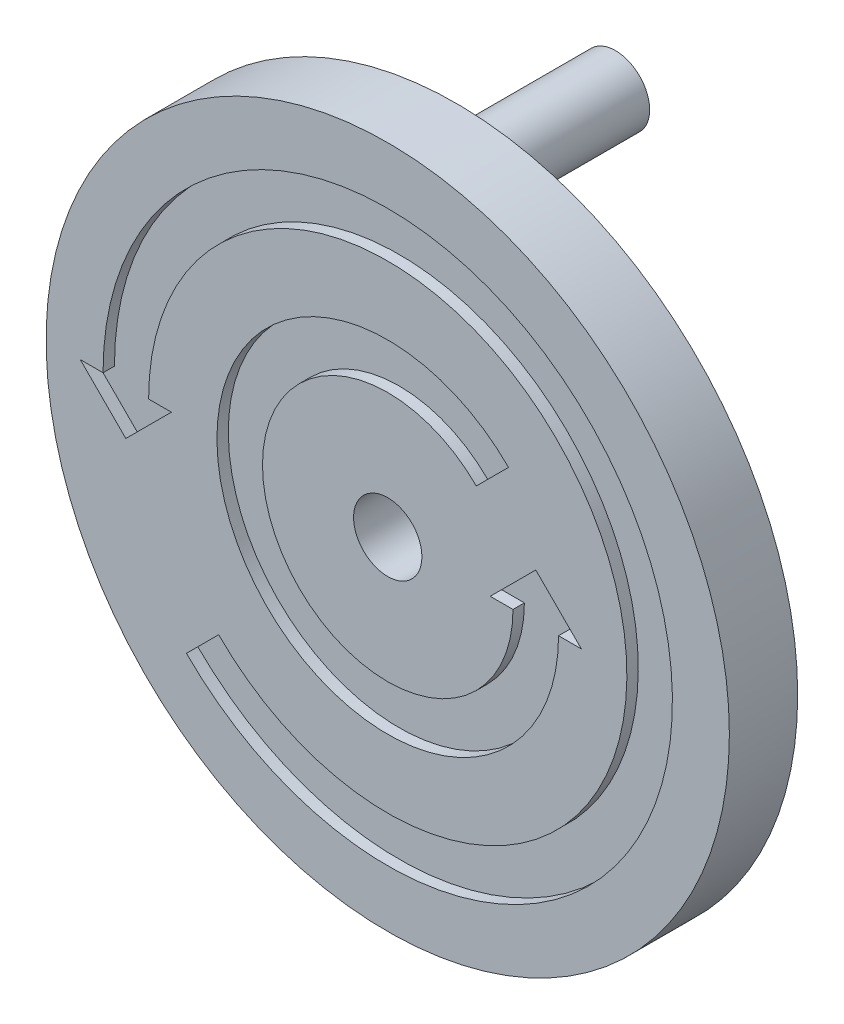
ISO-10303-21;
HEADER;
FILE_DESCRIPTION(('STEP AP214'),'2;1');
FILE_NAME('part.step','',(''),(''),'','','');
FILE_SCHEMA(('AUTOMOTIVE_DESIGN { 1 0 10303 214 1 1 1 1 }'));
ENDSEC;
DATA;
#1=APPLICATION_CONTEXT('core data for automotive mechanical design processes');
#2=APPLICATION_PROTOCOL_DEFINITION('international standard','automotive_design',2000,#1);
#3=PRODUCT_CONTEXT('',#1,'mechanical');
#4=PRODUCT('Part','Part','',(#3));
#5=PRODUCT_RELATED_PRODUCT_CATEGORY('part','',(#4));
#6=PRODUCT_DEFINITION_FORMATION('','',#4);
#7=PRODUCT_DEFINITION_CONTEXT('part definition',#1,'design');
#8=PRODUCT_DEFINITION('design','',#6,#7);
#9=PRODUCT_DEFINITION_SHAPE('','',#8);
#10=(LENGTH_UNIT() NAMED_UNIT(*) SI_UNIT(.MILLI.,.METRE.));
#11=(NAMED_UNIT(*) PLANE_ANGLE_UNIT() SI_UNIT($,.RADIAN.));
#12=(NAMED_UNIT(*) SI_UNIT($,.STERADIAN.) SOLID_ANGLE_UNIT());
#13=UNCERTAINTY_MEASURE_WITH_UNIT(LENGTH_MEASURE(1.E-05),#10,'distance_accuracy_value','');
#14=(GEOMETRIC_REPRESENTATION_CONTEXT(3) GLOBAL_UNCERTAINTY_ASSIGNED_CONTEXT((#13)) GLOBAL_UNIT_ASSIGNED_CONTEXT((#10,
#11,#12)) REPRESENTATION_CONTEXT('',''));
#15=CARTESIAN_POINT('',(0.,0.,0.));
#16=DIRECTION('',(0.,0.,1.));
#17=DIRECTION('',(1.,0.,0.));
#18=AXIS2_PLACEMENT_3D('',#15,#16,#17);
#19=CARTESIAN_POINT('',(0.,0.,3.));
#20=DIRECTION('',(0.,0.,1.));
#21=DIRECTION('',(1.,0.,0.));
#22=AXIS2_PLACEMENT_3D('',#19,#20,#21);
#23=PLANE('',#22);
#24=CARTESIAN_POINT('',(0.,0.,3.));
#25=DIRECTION('',(0.,0.,1.));
#26=DIRECTION('',(1.,0.,0.));
#27=AXIS2_PLACEMENT_3D('',#24,#25,#26);
#28=CIRCLE('',#27,12.5);
#29=CARTESIAN_POINT('',(-8.83883476483183,-8.83883476483186,3.));
#30=VERTEX_POINT('',#29);
#31=CARTESIAN_POINT('',(-12.5,0.,3.));
#32=VERTEX_POINT('',#31);
#33=EDGE_CURVE('E58',#30,#32,#28,.T.);
#34=ORIENTED_EDGE('',*,*,#33,.F.);
#35=DIRECTION('',(-0.707106781186546,-0.707106781186549,0.));
#36=VECTOR('',#35,1.);
#37=CARTESIAN_POINT('',(-7.42462120245874,-7.42462120245877,3.));
#38=LINE('',#37,#36);
#39=CARTESIAN_POINT('',(-7.42462120245874,-7.42462120245877,3.));
#40=VERTEX_POINT('',#39);
#41=EDGE_CURVE('E153',#40,#30,#38,.T.);
#42=ORIENTED_EDGE('',*,*,#41,.F.);
#43=CARTESIAN_POINT('',(0.,0.,3.));
#44=DIRECTION('',(0.,0.,-1.));
#45=DIRECTION('',(1.,0.,0.));
#46=AXIS2_PLACEMENT_3D('',#43,#44,#45);
#47=CIRCLE('',#46,10.5);
#48=CARTESIAN_POINT('',(-10.5,0.,3.));
#49=VERTEX_POINT('',#48);
#50=EDGE_CURVE('E158',#49,#40,#47,.T.);
#51=ORIENTED_EDGE('',*,*,#50,.F.);
#52=DIRECTION('',(-1.,0.,0.));
#53=VECTOR('',#52,1.);
#54=CARTESIAN_POINT('',(-9.5,0.,3.));
#55=LINE('',#54,#53);
#56=CARTESIAN_POINT('',(-9.5,0.,3.));
#57=VERTEX_POINT('',#56);
#58=EDGE_CURVE('E514',#57,#49,#55,.T.);
#59=ORIENTED_EDGE('',*,*,#58,.F.);
#60=DIRECTION('',(0.707106781186547,0.707106781186548,0.));
#61=VECTOR('',#60,1.);
#62=CARTESIAN_POINT('',(-11.5,-2.,3.));
#63=LINE('',#62,#61);
#64=CARTESIAN_POINT('',(-11.5,-2.,3.));
#65=VERTEX_POINT('',#64);
#66=EDGE_CURVE('E513',#65,#57,#63,.T.);
#67=ORIENTED_EDGE('',*,*,#66,.F.);
#68=DIRECTION('',(0.707106781186547,-0.707106781186548,0.));
#69=VECTOR('',#68,1.);
#70=CARTESIAN_POINT('',(-13.5,0.,3.));
#71=LINE('',#70,#69);
#72=CARTESIAN_POINT('',(-13.5,0.,3.));
#73=VERTEX_POINT('',#72);
#74=EDGE_CURVE('E168',#73,#65,#71,.T.);
#75=ORIENTED_EDGE('',*,*,#74,.F.);
#76=DIRECTION('',(-1.,0.,0.));
#77=VECTOR('',#76,1.);
#78=CARTESIAN_POINT('',(-12.5,0.,3.));
#79=LINE('',#78,#77);
#80=EDGE_CURVE('E164',#32,#73,#79,.T.);
#81=ORIENTED_EDGE('',*,*,#80,.F.);
#82=EDGE_LOOP('',(#34,#42,#51,#59,#67,#75,#81));
#83=FACE_BOUND('',#82,.T.);
#84=CARTESIAN_POINT('',(0.,0.,3.));
#85=DIRECTION('',(0.,0.,-1.));
#86=DIRECTION('',(1.,0.,0.));
#87=AXIS2_PLACEMENT_3D('',#84,#85,#86);
#88=CIRCLE('',#87,5.5);
#89=CARTESIAN_POINT('',(5.5,0.,3.));
#90=VERTEX_POINT('',#89);
#91=CARTESIAN_POINT('',(3.889087296526,3.88908729652602,3.));
#92=VERTEX_POINT('',#91);
#93=EDGE_CURVE('E66',#90,#92,#88,.T.);
#94=ORIENTED_EDGE('',*,*,#93,.F.);
#95=DIRECTION('',(1.,0.,0.));
#96=VECTOR('',#95,1.);
#97=CARTESIAN_POINT('',(5.5,0.,3.));
#98=LINE('',#97,#96);
#99=CARTESIAN_POINT('',(4.5,0.,3.));
#100=VERTEX_POINT('',#99);
#101=EDGE_CURVE('E195',#100,#90,#98,.T.);
#102=ORIENTED_EDGE('',*,*,#101,.F.);
#103=DIRECTION('',(-0.707106781186547,-0.707106781186548,0.));
#104=VECTOR('',#103,1.);
#105=CARTESIAN_POINT('',(4.5,0.,3.));
#106=LINE('',#105,#104);
#107=CARTESIAN_POINT('',(6.5,2.,3.));
#108=VERTEX_POINT('',#107);
#109=EDGE_CURVE('E225',#108,#100,#106,.T.);
#110=ORIENTED_EDGE('',*,*,#109,.F.);
#111=DIRECTION('',(-0.707106781186548,0.707106781186547,0.));
#112=VECTOR('',#111,1.);
#113=CARTESIAN_POINT('',(6.5,2.,3.));
#114=LINE('',#113,#112);
#115=CARTESIAN_POINT('',(8.5,0.,3.));
#116=VERTEX_POINT('',#115);
#117=EDGE_CURVE('E222',#116,#108,#114,.T.);
#118=ORIENTED_EDGE('',*,*,#117,.F.);
#119=DIRECTION('',(1.,0.,0.));
#120=VECTOR('',#119,1.);
#121=CARTESIAN_POINT('',(8.5,0.,3.));
#122=LINE('',#121,#120);
#123=CARTESIAN_POINT('',(7.5,0.,3.));
#124=VERTEX_POINT('',#123);
#125=EDGE_CURVE('E219',#124,#116,#122,.T.);
#126=ORIENTED_EDGE('',*,*,#125,.F.);
#127=CARTESIAN_POINT('',(0.,0.,3.));
#128=DIRECTION('',(0.,0.,1.));
#129=DIRECTION('',(1.,0.,0.));
#130=AXIS2_PLACEMENT_3D('',#127,#128,#129);
#131=CIRCLE('',#130,7.5);
#132=CARTESIAN_POINT('',(5.3033008588991,5.30330085889912,3.));
#133=VERTEX_POINT('',#132);
#134=EDGE_CURVE('E216',#133,#124,#131,.T.);
#135=ORIENTED_EDGE('',*,*,#134,.F.);
#136=DIRECTION('',(0.707106781186546,0.707106781186549,0.));
#137=VECTOR('',#136,1.);
#138=CARTESIAN_POINT('',(3.889087296526,3.88908729652602,3.));
#139=LINE('',#138,#137);
#140=EDGE_CURVE('E166',#92,#133,#139,.T.);
#141=ORIENTED_EDGE('',*,*,#140,.F.);
#142=EDGE_LOOP('',(#94,#102,#110,#118,#126,#135,#141));
#143=FACE_BOUND('',#142,.T.);
#144=CARTESIAN_POINT('',(0.,0.,3.));
#145=DIRECTION('',(0.,0.,1.));
#146=DIRECTION('',(1.,0.,0.));
#147=AXIS2_PLACEMENT_3D('',#144,#145,#146);
#148=CIRCLE('',#147,15.);
#149=CARTESIAN_POINT('',(15.,0.,3.));
#150=VERTEX_POINT('',#149);
#151=EDGE_CURVE('E11',#150,#150,#148,.T.);
#152=ORIENTED_EDGE('',*,*,#151,.T.);
#153=EDGE_LOOP('',(#152));
#154=FACE_BOUND('',#153,.T.);
#155=CARTESIAN_POINT('',(0.,0.,3.));
#156=DIRECTION('',(0.,0.,1.));
#157=DIRECTION('',(1.,0.,0.));
#158=AXIS2_PLACEMENT_3D('',#155,#156,#157);
#159=CIRCLE('',#158,1.5);
#160=CARTESIAN_POINT('',(1.5,0.,3.));
#161=VERTEX_POINT('',#160);
#162=EDGE_CURVE('E256',#161,#161,#159,.T.);
#163=ORIENTED_EDGE('',*,*,#162,.F.);
#164=EDGE_LOOP('',(#163));
#165=FACE_BOUND('',#164,.T.);
#166=ADVANCED_FACE('F43',(#83,#143,#154,#165),#23,.T.);
#167=CARTESIAN_POINT('',(0.,0.,0.));
#168=DIRECTION('',(0.,0.,1.));
#169=DIRECTION('',(1.,0.,0.));
#170=AXIS2_PLACEMENT_3D('',#167,#168,#169);
#171=PLANE('',#170);
#172=CARTESIAN_POINT('',(0.,0.,0.));
#173=DIRECTION('',(0.,0.,1.));
#174=DIRECTION('',(1.,0.,0.));
#175=AXIS2_PLACEMENT_3D('',#172,#173,#174);
#176=CIRCLE('',#175,15.);
#177=CARTESIAN_POINT('',(15.,0.,0.));
#178=VERTEX_POINT('',#177);
#179=EDGE_CURVE('E47',#178,#178,#176,.T.);
#180=ORIENTED_EDGE('',*,*,#179,.F.);
#181=EDGE_LOOP('',(#180));
#182=FACE_BOUND('',#181,.T.);
#183=CARTESIAN_POINT('',(0.,12.,0.));
#184=DIRECTION('',(0.,0.,1.));
#185=DIRECTION('',(1.,0.,0.));
#186=AXIS2_PLACEMENT_3D('',#183,#184,#185);
#187=CIRCLE('',#186,1.5);
#188=CARTESIAN_POINT('',(1.5,12.,0.));
#189=VERTEX_POINT('',#188);
#190=EDGE_CURVE('E247',#189,#189,#187,.T.);
#191=ORIENTED_EDGE('',*,*,#190,.T.);
#192=EDGE_LOOP('',(#191));
#193=FACE_BOUND('',#192,.T.);
#194=CARTESIAN_POINT('',(0.,-12.,0.));
#195=DIRECTION('',(0.,0.,1.));
#196=DIRECTION('',(1.,0.,0.));
#197=AXIS2_PLACEMENT_3D('',#194,#195,#196);
#198=CIRCLE('',#197,1.5);
#199=CARTESIAN_POINT('',(1.5,-12.,0.));
#200=VERTEX_POINT('',#199);
#201=EDGE_CURVE('E252',#200,#200,#198,.T.);
#202=ORIENTED_EDGE('',*,*,#201,.T.);
#203=EDGE_LOOP('',(#202));
#204=FACE_BOUND('',#203,.T.);
#205=CARTESIAN_POINT('',(0.,0.,0.));
#206=DIRECTION('',(0.,0.,1.));
#207=DIRECTION('',(1.,0.,0.));
#208=AXIS2_PLACEMENT_3D('',#205,#206,#207);
#209=CIRCLE('',#208,1.5);
#210=CARTESIAN_POINT('',(1.5,0.,0.));
#211=VERTEX_POINT('',#210);
#212=EDGE_CURVE('E255',#211,#211,#209,.T.);
#213=ORIENTED_EDGE('',*,*,#212,.T.);
#214=EDGE_LOOP('',(#213));
#215=FACE_BOUND('',#214,.T.);
#216=ADVANCED_FACE('F262',(#182,#193,#204,#215),#171,.F.);
#217=CARTESIAN_POINT('',(0.,0.,3.));
#218=DIRECTION('',(0.,0.,-1.));
#219=DIRECTION('',(-1.,0.,0.));
#220=AXIS2_PLACEMENT_3D('',#217,#218,#219);
#221=CYLINDRICAL_SURFACE('',#220,15.);
#222=ORIENTED_EDGE('',*,*,#151,.F.);
#223=EDGE_LOOP('',(#222));
#224=FACE_BOUND('',#223,.T.);
#225=ORIENTED_EDGE('',*,*,#179,.T.);
#226=EDGE_LOOP('',(#225));
#227=FACE_BOUND('',#226,.T.);
#228=ADVANCED_FACE('F45',(#224,#227),#221,.T.);
#229=CARTESIAN_POINT('',(0.,0.,3.));
#230=DIRECTION('',(0.,0.,-1.));
#231=DIRECTION('',(-1.,0.,0.));
#232=AXIS2_PLACEMENT_3D('',#229,#230,#231);
#233=CYLINDRICAL_SURFACE('',#232,1.5);
#234=ORIENTED_EDGE('',*,*,#162,.T.);
#235=EDGE_LOOP('',(#234));
#236=FACE_BOUND('',#235,.T.);
#237=ORIENTED_EDGE('',*,*,#212,.F.);
#238=EDGE_LOOP('',(#237));
#239=FACE_BOUND('',#238,.T.);
#240=ADVANCED_FACE('F264',(#236,#239),#233,.F.);
#241=CARTESIAN_POINT('',(0.,12.,-7.));
#242=DIRECTION('',(0.,0.,1.));
#243=DIRECTION('',(1.,0.,0.));
#244=AXIS2_PLACEMENT_3D('',#241,#242,#243);
#245=CYLINDRICAL_SURFACE('',#244,1.5);
#246=CARTESIAN_POINT('',(0.,12.,-7.));
#247=DIRECTION('',(0.,0.,1.));
#248=DIRECTION('',(1.,0.,0.));
#249=AXIS2_PLACEMENT_3D('',#246,#247,#248);
#250=CIRCLE('',#249,1.5);
#251=CARTESIAN_POINT('',(1.5,12.,-7.));
#252=VERTEX_POINT('',#251);
#253=EDGE_CURVE('E232',#252,#252,#250,.T.);
#254=ORIENTED_EDGE('',*,*,#253,.T.);
#255=EDGE_LOOP('',(#254));
#256=FACE_BOUND('',#255,.T.);
#257=ORIENTED_EDGE('',*,*,#190,.F.);
#258=EDGE_LOOP('',(#257));
#259=FACE_BOUND('',#258,.T.);
#260=ADVANCED_FACE('F266',(#256,#259),#245,.T.);
#261=CARTESIAN_POINT('',(0.,12.,-7.));
#262=DIRECTION('',(0.,0.,1.));
#263=DIRECTION('',(1.,0.,0.));
#264=AXIS2_PLACEMENT_3D('',#261,#262,#263);
#265=PLANE('',#264);
#266=ORIENTED_EDGE('',*,*,#253,.F.);
#267=EDGE_LOOP('',(#266));
#268=FACE_BOUND('',#267,.T.);
#269=ADVANCED_FACE('F273',(#268),#265,.F.);
#270=CARTESIAN_POINT('',(0.,-12.,-7.));
#271=DIRECTION('',(0.,0.,1.));
#272=DIRECTION('',(1.,0.,0.));
#273=AXIS2_PLACEMENT_3D('',#270,#271,#272);
#274=CYLINDRICAL_SURFACE('',#273,1.5);
#275=CARTESIAN_POINT('',(0.,-12.,-7.));
#276=DIRECTION('',(0.,0.,1.));
#277=DIRECTION('',(1.,0.,0.));
#278=AXIS2_PLACEMENT_3D('',#275,#276,#277);
#279=CIRCLE('',#278,1.5);
#280=CARTESIAN_POINT('',(1.5,-12.,-7.));
#281=VERTEX_POINT('',#280);
#282=EDGE_CURVE('E244',#281,#281,#279,.T.);
#283=ORIENTED_EDGE('',*,*,#282,.T.);
#284=EDGE_LOOP('',(#283));
#285=FACE_BOUND('',#284,.T.);
#286=ORIENTED_EDGE('',*,*,#201,.F.);
#287=EDGE_LOOP('',(#286));
#288=FACE_BOUND('',#287,.T.);
#289=ADVANCED_FACE('F295',(#285,#288),#274,.T.);
#290=CARTESIAN_POINT('',(0.,-12.,-7.));
#291=DIRECTION('',(0.,0.,1.));
#292=DIRECTION('',(1.,0.,0.));
#293=AXIS2_PLACEMENT_3D('',#290,#291,#292);
#294=PLANE('',#293);
#295=ORIENTED_EDGE('',*,*,#282,.F.);
#296=EDGE_LOOP('',(#295));
#297=FACE_BOUND('',#296,.T.);
#298=ADVANCED_FACE('F297',(#297),#294,.F.);
#299=CARTESIAN_POINT('',(0.,0.,2.5));
#300=DIRECTION('',(0.,0.,1.));
#301=DIRECTION('',(1.,0.,0.));
#302=AXIS2_PLACEMENT_3D('',#299,#300,#301);
#303=CYLINDRICAL_SURFACE('',#302,5.5);
#304=ORIENTED_EDGE('',*,*,#93,.T.);
#305=DIRECTION('',(0.,0.,1.));
#306=VECTOR('',#305,1.);
#307=CARTESIAN_POINT('',(3.889087296526,3.88908729652602,2.5));
#308=LINE('',#307,#306);
#309=CARTESIAN_POINT('',(3.889087296526,3.88908729652602,2.5));
#310=VERTEX_POINT('',#309);
#311=EDGE_CURVE('E212',#310,#92,#308,.T.);
#312=ORIENTED_EDGE('',*,*,#311,.F.);
#313=CARTESIAN_POINT('',(0.,0.,2.5));
#314=DIRECTION('',(0.,0.,-1.));
#315=DIRECTION('',(1.,0.,0.));
#316=AXIS2_PLACEMENT_3D('',#313,#314,#315);
#317=CIRCLE('',#316,5.5);
#318=CARTESIAN_POINT('',(5.5,0.,2.5));
#319=VERTEX_POINT('',#318);
#320=EDGE_CURVE('E191',#319,#310,#317,.T.);
#321=ORIENTED_EDGE('',*,*,#320,.F.);
#322=DIRECTION('',(0.,0.,1.));
#323=VECTOR('',#322,1.);
#324=CARTESIAN_POINT('',(5.5,0.,2.5));
#325=LINE('',#324,#323);
#326=EDGE_CURVE('E230',#319,#90,#325,.T.);
#327=ORIENTED_EDGE('',*,*,#326,.T.);
#328=EDGE_LOOP('',(#304,#312,#321,#327));
#329=FACE_BOUND('',#328,.T.);
#330=ADVANCED_FACE('F303',(#329),#303,.T.);
#331=CARTESIAN_POINT('',(5.5,0.,2.5));
#332=DIRECTION('',(0.,-1.,0.));
#333=DIRECTION('',(1.,0.,0.));
#334=AXIS2_PLACEMENT_3D('',#331,#332,#333);
#335=PLANE('',#334);
#336=ORIENTED_EDGE('',*,*,#101,.T.);
#337=ORIENTED_EDGE('',*,*,#326,.F.);
#338=DIRECTION('',(1.,0.,0.));
#339=VECTOR('',#338,1.);
#340=CARTESIAN_POINT('',(5.5,0.,2.5));
#341=LINE('',#340,#339);
#342=CARTESIAN_POINT('',(4.5,0.,2.5));
#343=VERTEX_POINT('',#342);
#344=EDGE_CURVE('E210',#343,#319,#341,.T.);
#345=ORIENTED_EDGE('',*,*,#344,.F.);
#346=DIRECTION('',(0.,0.,1.));
#347=VECTOR('',#346,1.);
#348=CARTESIAN_POINT('',(4.5,0.,2.5));
#349=LINE('',#348,#347);
#350=EDGE_CURVE('E233',#343,#100,#349,.T.);
#351=ORIENTED_EDGE('',*,*,#350,.T.);
#352=EDGE_LOOP('',(#336,#337,#345,#351));
#353=FACE_BOUND('',#352,.T.);
#354=ADVANCED_FACE('F309',(#353),#335,.F.);
#355=CARTESIAN_POINT('',(4.5,0.,2.5));
#356=DIRECTION('',(-0.707106781186548,0.707106781186547,0.));
#357=DIRECTION('',(-0.707106781186547,-0.707106781186548,0.));
#358=AXIS2_PLACEMENT_3D('',#355,#356,#357);
#359=PLANE('',#358);
#360=ORIENTED_EDGE('',*,*,#109,.T.);
#361=ORIENTED_EDGE('',*,*,#350,.F.);
#362=DIRECTION('',(-0.707106781186547,-0.707106781186548,0.));
#363=VECTOR('',#362,1.);
#364=CARTESIAN_POINT('',(4.5,0.,2.5));
#365=LINE('',#364,#363);
#366=CARTESIAN_POINT('',(6.5,2.,2.5));
#367=VERTEX_POINT('',#366);
#368=EDGE_CURVE('E207',#367,#343,#365,.T.);
#369=ORIENTED_EDGE('',*,*,#368,.F.);
#370=DIRECTION('',(0.,0.,1.));
#371=VECTOR('',#370,1.);
#372=CARTESIAN_POINT('',(6.5,2.,2.5));
#373=LINE('',#372,#371);
#374=EDGE_CURVE('E235',#367,#108,#373,.T.);
#375=ORIENTED_EDGE('',*,*,#374,.T.);
#376=EDGE_LOOP('',(#360,#361,#369,#375));
#377=FACE_BOUND('',#376,.T.);
#378=ADVANCED_FACE('F326',(#377),#359,.F.);
#379=CARTESIAN_POINT('',(6.5,2.,2.5));
#380=DIRECTION('',(0.707106781186547,0.707106781186548,0.));
#381=DIRECTION('',(-0.707106781186548,0.707106781186547,0.));
#382=AXIS2_PLACEMENT_3D('',#379,#380,#381);
#383=PLANE('',#382);
#384=ORIENTED_EDGE('',*,*,#117,.T.);
#385=ORIENTED_EDGE('',*,*,#374,.F.);
#386=DIRECTION('',(-0.707106781186548,0.707106781186547,0.));
#387=VECTOR('',#386,1.);
#388=CARTESIAN_POINT('',(6.5,2.,2.5));
#389=LINE('',#388,#387);
#390=CARTESIAN_POINT('',(8.5,0.,2.5));
#391=VERTEX_POINT('',#390);
#392=EDGE_CURVE('E204',#391,#367,#389,.T.);
#393=ORIENTED_EDGE('',*,*,#392,.F.);
#394=DIRECTION('',(0.,0.,1.));
#395=VECTOR('',#394,1.);
#396=CARTESIAN_POINT('',(8.5,0.,2.5));
#397=LINE('',#396,#395);
#398=EDGE_CURVE('E237',#391,#116,#397,.T.);
#399=ORIENTED_EDGE('',*,*,#398,.T.);
#400=EDGE_LOOP('',(#384,#385,#393,#399));
#401=FACE_BOUND('',#400,.T.);
#402=ADVANCED_FACE('F322',(#401),#383,.F.);
#403=CARTESIAN_POINT('',(8.5,0.,2.5));
#404=DIRECTION('',(0.,-1.,0.));
#405=DIRECTION('',(1.,0.,0.));
#406=AXIS2_PLACEMENT_3D('',#403,#404,#405);
#407=PLANE('',#406);
#408=ORIENTED_EDGE('',*,*,#125,.T.);
#409=ORIENTED_EDGE('',*,*,#398,.F.);
#410=DIRECTION('',(1.,0.,0.));
#411=VECTOR('',#410,1.);
#412=CARTESIAN_POINT('',(8.5,0.,2.5));
#413=LINE('',#412,#411);
#414=CARTESIAN_POINT('',(7.5,0.,2.5));
#415=VERTEX_POINT('',#414);
#416=EDGE_CURVE('E201',#415,#391,#413,.T.);
#417=ORIENTED_EDGE('',*,*,#416,.F.);
#418=DIRECTION('',(0.,0.,1.));
#419=VECTOR('',#418,1.);
#420=CARTESIAN_POINT('',(7.5,0.,2.5));
#421=LINE('',#420,#419);
#422=EDGE_CURVE('E239',#415,#124,#421,.T.);
#423=ORIENTED_EDGE('',*,*,#422,.T.);
#424=EDGE_LOOP('',(#408,#409,#417,#423));
#425=FACE_BOUND('',#424,.T.);
#426=ADVANCED_FACE('F318',(#425),#407,.F.);
#427=CARTESIAN_POINT('',(0.,0.,2.5));
#428=DIRECTION('',(0.,0.,1.));
#429=DIRECTION('',(1.,0.,0.));
#430=AXIS2_PLACEMENT_3D('',#427,#428,#429);
#431=CYLINDRICAL_SURFACE('',#430,7.5);
#432=ORIENTED_EDGE('',*,*,#134,.T.);
#433=ORIENTED_EDGE('',*,*,#422,.F.);
#434=CARTESIAN_POINT('',(0.,0.,2.5));
#435=DIRECTION('',(0.,0.,1.));
#436=DIRECTION('',(1.,0.,0.));
#437=AXIS2_PLACEMENT_3D('',#434,#435,#436);
#438=CIRCLE('',#437,7.5);
#439=CARTESIAN_POINT('',(5.3033008588991,5.30330085889912,2.5));
#440=VERTEX_POINT('',#439);
#441=EDGE_CURVE('E198',#440,#415,#438,.T.);
#442=ORIENTED_EDGE('',*,*,#441,.F.);
#443=DIRECTION('',(0.,0.,1.));
#444=VECTOR('',#443,1.);
#445=CARTESIAN_POINT('',(5.3033008588991,5.30330085889912,2.5));
#446=LINE('',#445,#444);
#447=EDGE_CURVE('E241',#440,#133,#446,.T.);
#448=ORIENTED_EDGE('',*,*,#447,.T.);
#449=EDGE_LOOP('',(#432,#433,#442,#448));
#450=FACE_BOUND('',#449,.T.);
#451=ADVANCED_FACE('F314',(#450),#431,.F.);
#452=CARTESIAN_POINT('',(3.889087296526,3.88908729652602,2.5));
#453=DIRECTION('',(0.707106781186549,-0.707106781186546,0.));
#454=DIRECTION('',(0.707106781186546,0.707106781186549,0.));
#455=AXIS2_PLACEMENT_3D('',#452,#453,#454);
#456=PLANE('',#455);
#457=ORIENTED_EDGE('',*,*,#140,.T.);
#458=ORIENTED_EDGE('',*,*,#447,.F.);
#459=DIRECTION('',(0.707106781186546,0.707106781186549,0.));
#460=VECTOR('',#459,1.);
#461=CARTESIAN_POINT('',(3.889087296526,3.88908729652602,2.5));
#462=LINE('',#461,#460);
#463=EDGE_CURVE('E194',#310,#440,#462,.T.);
#464=ORIENTED_EDGE('',*,*,#463,.F.);
#465=ORIENTED_EDGE('',*,*,#311,.T.);
#466=EDGE_LOOP('',(#457,#458,#464,#465));
#467=FACE_BOUND('',#466,.T.);
#468=ADVANCED_FACE('F310',(#467),#456,.F.);
#469=CARTESIAN_POINT('',(0.,0.,2.5));
#470=DIRECTION('',(0.,0.,1.));
#471=DIRECTION('',(1.,0.,0.));
#472=AXIS2_PLACEMENT_3D('',#469,#470,#471);
#473=PLANE('',#472);
#474=ORIENTED_EDGE('',*,*,#320,.T.);
#475=ORIENTED_EDGE('',*,*,#463,.T.);
#476=ORIENTED_EDGE('',*,*,#441,.T.);
#477=ORIENTED_EDGE('',*,*,#416,.T.);
#478=ORIENTED_EDGE('',*,*,#392,.T.);
#479=ORIENTED_EDGE('',*,*,#368,.T.);
#480=ORIENTED_EDGE('',*,*,#344,.T.);
#481=EDGE_LOOP('',(#474,#475,#476,#477,#478,#479,#480));
#482=FACE_BOUND('',#481,.T.);
#483=ADVANCED_FACE('F313',(#482),#473,.T.);
#484=CARTESIAN_POINT('',(0.,0.,2.5));
#485=DIRECTION('',(0.,0.,1.));
#486=DIRECTION('',(1.,0.,0.));
#487=AXIS2_PLACEMENT_3D('',#484,#485,#486);
#488=CYLINDRICAL_SURFACE('',#487,12.5);
#489=ORIENTED_EDGE('',*,*,#33,.T.);
#490=DIRECTION('',(0.,0.,1.));
#491=VECTOR('',#490,1.);
#492=CARTESIAN_POINT('',(-12.5,0.,2.5));
#493=LINE('',#492,#491);
#494=CARTESIAN_POINT('',(-12.5,0.,2.5));
#495=VERTEX_POINT('',#494);
#496=EDGE_CURVE('E175',#495,#32,#493,.T.);
#497=ORIENTED_EDGE('',*,*,#496,.F.);
#498=CARTESIAN_POINT('',(0.,0.,2.5));
#499=DIRECTION('',(0.,0.,1.));
#500=DIRECTION('',(1.,0.,0.));
#501=AXIS2_PLACEMENT_3D('',#498,#499,#500);
#502=CIRCLE('',#501,12.5);
#503=CARTESIAN_POINT('',(-8.83883476483183,-8.83883476483186,2.5));
#504=VERTEX_POINT('',#503);
#505=EDGE_CURVE('E146',#504,#495,#502,.T.);
#506=ORIENTED_EDGE('',*,*,#505,.F.);
#507=DIRECTION('',(0.,0.,1.));
#508=VECTOR('',#507,1.);
#509=CARTESIAN_POINT('',(-8.83883476483183,-8.83883476483186,2.5));
#510=LINE('',#509,#508);
#511=EDGE_CURVE('E142',#504,#30,#510,.T.);
#512=ORIENTED_EDGE('',*,*,#511,.T.);
#513=EDGE_LOOP('',(#489,#497,#506,#512));
#514=FACE_BOUND('',#513,.T.);
#515=ADVANCED_FACE('F144',(#514),#488,.F.);
#516=CARTESIAN_POINT('',(-7.42462120245874,-7.42462120245877,2.5));
#517=DIRECTION('',(-0.707106781186549,0.707106781186546,0.));
#518=DIRECTION('',(-0.707106781186546,-0.707106781186549,0.));
#519=AXIS2_PLACEMENT_3D('',#516,#517,#518);
#520=PLANE('',#519);
#521=ORIENTED_EDGE('',*,*,#41,.T.);
#522=ORIENTED_EDGE('',*,*,#511,.F.);
#523=DIRECTION('',(-0.707106781186546,-0.707106781186549,0.));
#524=VECTOR('',#523,1.);
#525=CARTESIAN_POINT('',(-7.42462120245874,-7.42462120245877,2.5));
#526=LINE('',#525,#524);
#527=CARTESIAN_POINT('',(-7.42462120245874,-7.42462120245877,2.5));
#528=VERTEX_POINT('',#527);
#529=EDGE_CURVE('E172',#528,#504,#526,.T.);
#530=ORIENTED_EDGE('',*,*,#529,.F.);
#531=DIRECTION('',(0.,0.,1.));
#532=VECTOR('',#531,1.);
#533=CARTESIAN_POINT('',(-7.42462120245874,-7.42462120245877,2.5));
#534=LINE('',#533,#532);
#535=EDGE_CURVE('E150',#528,#40,#534,.T.);
#536=ORIENTED_EDGE('',*,*,#535,.T.);
#537=EDGE_LOOP('',(#521,#522,#530,#536));
#538=FACE_BOUND('',#537,.T.);
#539=ADVANCED_FACE('F154',(#538),#520,.F.);
#540=CARTESIAN_POINT('',(0.,0.,2.5));
#541=DIRECTION('',(0.,0.,1.));
#542=DIRECTION('',(1.,0.,0.));
#543=AXIS2_PLACEMENT_3D('',#540,#541,#542);
#544=CYLINDRICAL_SURFACE('',#543,10.5);
#545=ORIENTED_EDGE('',*,*,#50,.T.);
#546=ORIENTED_EDGE('',*,*,#535,.F.);
#547=CARTESIAN_POINT('',(0.,0.,2.5));
#548=DIRECTION('',(0.,0.,-1.));
#549=DIRECTION('',(1.,0.,0.));
#550=AXIS2_PLACEMENT_3D('',#547,#548,#549);
#551=CIRCLE('',#550,10.5);
#552=CARTESIAN_POINT('',(-10.5,0.,2.5));
#553=VERTEX_POINT('',#552);
#554=EDGE_CURVE('E174',#553,#528,#551,.T.);
#555=ORIENTED_EDGE('',*,*,#554,.F.);
#556=DIRECTION('',(0.,0.,1.));
#557=VECTOR('',#556,1.);
#558=CARTESIAN_POINT('',(-10.5,0.,2.5));
#559=LINE('',#558,#557);
#560=EDGE_CURVE('E521',#553,#49,#559,.T.);
#561=ORIENTED_EDGE('',*,*,#560,.T.);
#562=EDGE_LOOP('',(#545,#546,#555,#561));
#563=FACE_BOUND('',#562,.T.);
#564=ADVANCED_FACE('F344',(#563),#544,.T.);
#565=CARTESIAN_POINT('',(-9.5,0.,2.5));
#566=DIRECTION('',(0.,1.,0.));
#567=DIRECTION('',(-1.,0.,0.));
#568=AXIS2_PLACEMENT_3D('',#565,#566,#567);
#569=PLANE('',#568);
#570=ORIENTED_EDGE('',*,*,#58,.T.);
#571=ORIENTED_EDGE('',*,*,#560,.F.);
#572=DIRECTION('',(-1.,0.,0.));
#573=VECTOR('',#572,1.);
#574=CARTESIAN_POINT('',(-9.5,0.,2.5));
#575=LINE('',#574,#573);
#576=CARTESIAN_POINT('',(-9.5,0.,2.5));
#577=VERTEX_POINT('',#576);
#578=EDGE_CURVE('E178',#577,#553,#575,.T.);
#579=ORIENTED_EDGE('',*,*,#578,.F.);
#580=DIRECTION('',(0.,0.,1.));
#581=VECTOR('',#580,1.);
#582=CARTESIAN_POINT('',(-9.5,0.,2.5));
#583=LINE('',#582,#581);
#584=EDGE_CURVE('E523',#577,#57,#583,.T.);
#585=ORIENTED_EDGE('',*,*,#584,.T.);
#586=EDGE_LOOP('',(#570,#571,#579,#585));
#587=FACE_BOUND('',#586,.T.);
#588=ADVANCED_FACE('F347',(#587),#569,.F.);
#589=CARTESIAN_POINT('',(-11.5,-2.,2.5));
#590=DIRECTION('',(0.707106781186548,-0.707106781186547,0.));
#591=DIRECTION('',(0.707106781186547,0.707106781186548,0.));
#592=AXIS2_PLACEMENT_3D('',#589,#590,#591);
#593=PLANE('',#592);
#594=ORIENTED_EDGE('',*,*,#66,.T.);
#595=ORIENTED_EDGE('',*,*,#584,.F.);
#596=DIRECTION('',(0.707106781186547,0.707106781186548,0.));
#597=VECTOR('',#596,1.);
#598=CARTESIAN_POINT('',(-11.5,-2.,2.5));
#599=LINE('',#598,#597);
#600=CARTESIAN_POINT('',(-11.5,-2.,2.5));
#601=VERTEX_POINT('',#600);
#602=EDGE_CURVE('E181',#601,#577,#599,.T.);
#603=ORIENTED_EDGE('',*,*,#602,.F.);
#604=DIRECTION('',(0.,0.,1.));
#605=VECTOR('',#604,1.);
#606=CARTESIAN_POINT('',(-11.5,-2.,2.5));
#607=LINE('',#606,#605);
#608=EDGE_CURVE('E525',#601,#65,#607,.T.);
#609=ORIENTED_EDGE('',*,*,#608,.T.);
#610=EDGE_LOOP('',(#594,#595,#603,#609));
#611=FACE_BOUND('',#610,.T.);
#612=ADVANCED_FACE('F351',(#611),#593,.F.);
#613=CARTESIAN_POINT('',(-13.5,0.,2.5));
#614=DIRECTION('',(-0.707106781186548,-0.707106781186547,0.));
#615=DIRECTION('',(0.707106781186547,-0.707106781186548,0.));
#616=AXIS2_PLACEMENT_3D('',#613,#614,#615);
#617=PLANE('',#616);
#618=ORIENTED_EDGE('',*,*,#74,.T.);
#619=ORIENTED_EDGE('',*,*,#608,.F.);
#620=DIRECTION('',(0.707106781186547,-0.707106781186548,0.));
#621=VECTOR('',#620,1.);
#622=CARTESIAN_POINT('',(-13.5,0.,2.5));
#623=LINE('',#622,#621);
#624=CARTESIAN_POINT('',(-13.5,0.,2.5));
#625=VERTEX_POINT('',#624);
#626=EDGE_CURVE('E184',#625,#601,#623,.T.);
#627=ORIENTED_EDGE('',*,*,#626,.F.);
#628=DIRECTION('',(0.,0.,1.));
#629=VECTOR('',#628,1.);
#630=CARTESIAN_POINT('',(-13.5,0.,2.5));
#631=LINE('',#630,#629);
#632=EDGE_CURVE('E507',#625,#73,#631,.T.);
#633=ORIENTED_EDGE('',*,*,#632,.T.);
#634=EDGE_LOOP('',(#618,#619,#627,#633));
#635=FACE_BOUND('',#634,.T.);
#636=ADVANCED_FACE('F355',(#635),#617,.F.);
#637=CARTESIAN_POINT('',(-12.5,0.,2.5));
#638=DIRECTION('',(0.,1.,0.));
#639=DIRECTION('',(-1.,0.,0.));
#640=AXIS2_PLACEMENT_3D('',#637,#638,#639);
#641=PLANE('',#640);
#642=ORIENTED_EDGE('',*,*,#80,.T.);
#643=ORIENTED_EDGE('',*,*,#632,.F.);
#644=DIRECTION('',(-1.,0.,0.));
#645=VECTOR('',#644,1.);
#646=CARTESIAN_POINT('',(-12.5,0.,2.5));
#647=LINE('',#646,#645);
#648=EDGE_CURVE('E187',#495,#625,#647,.T.);
#649=ORIENTED_EDGE('',*,*,#648,.F.);
#650=ORIENTED_EDGE('',*,*,#496,.T.);
#651=EDGE_LOOP('',(#642,#643,#649,#650));
#652=FACE_BOUND('',#651,.T.);
#653=ADVANCED_FACE('F340',(#652),#641,.F.);
#654=CARTESIAN_POINT('',(0.,0.,2.5));
#655=DIRECTION('',(0.,0.,1.));
#656=DIRECTION('',(1.,0.,0.));
#657=AXIS2_PLACEMENT_3D('',#654,#655,#656);
#658=PLANE('',#657);
#659=ORIENTED_EDGE('',*,*,#505,.T.);
#660=ORIENTED_EDGE('',*,*,#648,.T.);
#661=ORIENTED_EDGE('',*,*,#626,.T.);
#662=ORIENTED_EDGE('',*,*,#602,.T.);
#663=ORIENTED_EDGE('',*,*,#578,.T.);
#664=ORIENTED_EDGE('',*,*,#554,.T.);
#665=ORIENTED_EDGE('',*,*,#529,.T.);
#666=EDGE_LOOP('',(#659,#660,#661,#662,#663,#664,#665));
#667=FACE_BOUND('',#666,.T.);
#668=ADVANCED_FACE('F337',(#667),#658,.T.);
#669=CLOSED_SHELL('',(#166,#216,#228,#240,#260,#269,#289,#298,#330,#354,#378,#402,#426,#451,
#468,#483,#515,#539,#564,#588,#612,#636,#653,#668));
#670=MANIFOLD_SOLID_BREP('B2',#669);
#671=ADVANCED_BREP_SHAPE_REPRESENTATION('',(#18,#670),#14);
#672=SHAPE_DEFINITION_REPRESENTATION(#9,#671);
ENDSEC;
END-ISO-10303-21;
